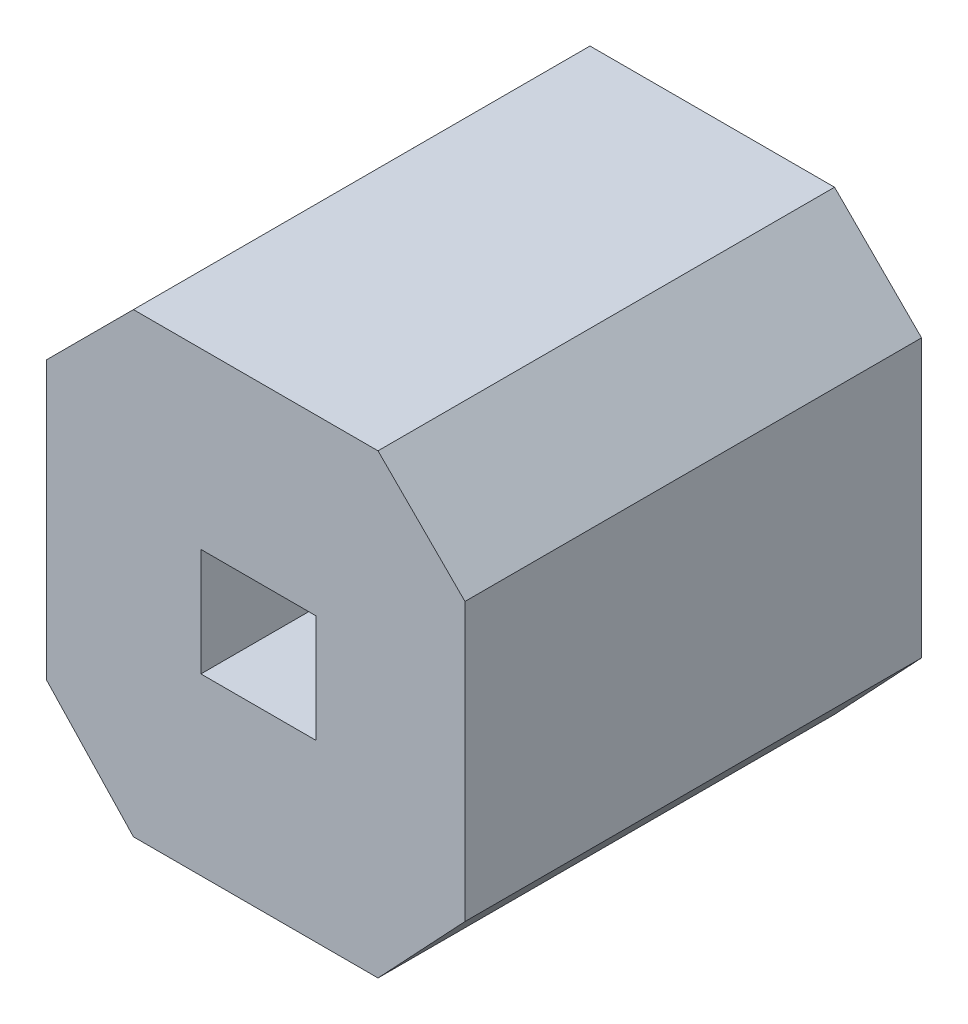
ISO-10303-21;
HEADER;
FILE_DESCRIPTION(('STEP AP214'),'2;1');
FILE_NAME('part.step','',(''),(''),'','','');
FILE_SCHEMA(('AUTOMOTIVE_DESIGN { 1 0 10303 214 1 1 1 1 }'));
ENDSEC;
DATA;
#1=APPLICATION_CONTEXT('core data for automotive mechanical design processes');
#2=APPLICATION_PROTOCOL_DEFINITION('international standard','automotive_design',2000,#1);
#3=PRODUCT_CONTEXT('',#1,'mechanical');
#4=PRODUCT('Part','Part','',(#3));
#5=PRODUCT_RELATED_PRODUCT_CATEGORY('part','',(#4));
#6=PRODUCT_DEFINITION_FORMATION('','',#4);
#7=PRODUCT_DEFINITION_CONTEXT('part definition',#1,'design');
#8=PRODUCT_DEFINITION('design','',#6,#7);
#9=PRODUCT_DEFINITION_SHAPE('','',#8);
#10=(LENGTH_UNIT() NAMED_UNIT(*) SI_UNIT(.MILLI.,.METRE.));
#11=(NAMED_UNIT(*) PLANE_ANGLE_UNIT() SI_UNIT($,.RADIAN.));
#12=(NAMED_UNIT(*) SI_UNIT($,.STERADIAN.) SOLID_ANGLE_UNIT());
#13=UNCERTAINTY_MEASURE_WITH_UNIT(LENGTH_MEASURE(1.E-05),#10,'distance_accuracy_value','');
#14=(GEOMETRIC_REPRESENTATION_CONTEXT(3) GLOBAL_UNCERTAINTY_ASSIGNED_CONTEXT((#13)) GLOBAL_UNIT_ASSIGNED_CONTEXT((#10,
#11,#12)) REPRESENTATION_CONTEXT('',''));
#15=CARTESIAN_POINT('',(0.,0.,0.));
#16=DIRECTION('',(0.,0.,1.));
#17=DIRECTION('',(1.,0.,0.));
#18=AXIS2_PLACEMENT_3D('',#15,#16,#17);
#19=CARTESIAN_POINT('',(0.08073259147931,0.,-11.));
#20=DIRECTION('',(-1.,0.,0.));
#21=DIRECTION('',(0.,0.,1.));
#22=AXIS2_PLACEMENT_3D('',#19,#20,#21);
#23=PLANE('',#22);
#24=DIRECTION('',(0.,0.,-1.));
#25=VECTOR('',#24,1.);
#26=CARTESIAN_POINT('',(0.08073259147931,0.656542766425,-1.));
#27=LINE('',#26,#25);
#28=CARTESIAN_POINT('',(0.08073259147931,0.656542766425,-1.));
#29=VERTEX_POINT('',#28);
#30=CARTESIAN_POINT('',(0.08073259147931,0.656542766425,-3.54));
#31=VERTEX_POINT('',#30);
#32=EDGE_CURVE('E143',#29,#31,#27,.T.);
#33=ORIENTED_EDGE('',*,*,#32,.F.);
#34=DIRECTION('',(0.,-1.,0.));
#35=VECTOR('',#34,1.);
#36=CARTESIAN_POINT('',(0.08073259147931,0.,-1.));
#37=LINE('',#36,#35);
#38=CARTESIAN_POINT('',(0.08073259147931,2.198685623546,-1.));
#39=VERTEX_POINT('',#38);
#40=EDGE_CURVE('E226',#39,#29,#37,.T.);
#41=ORIENTED_EDGE('',*,*,#40,.F.);
#42=DIRECTION('',(0.,0.,-1.));
#43=VECTOR('',#42,1.);
#44=CARTESIAN_POINT('',(0.08073259147931,2.198685623546,-1.));
#45=LINE('',#44,#43);
#46=CARTESIAN_POINT('',(0.08073259147931,2.198685623546,-3.54));
#47=VERTEX_POINT('',#46);
#48=EDGE_CURVE('E159',#39,#47,#45,.T.);
#49=ORIENTED_EDGE('',*,*,#48,.T.);
#50=DIRECTION('',(0.,-1.,0.));
#51=VECTOR('',#50,1.);
#52=CARTESIAN_POINT('',(0.08073259147931,20.864971337567,-3.54));
#53=LINE('',#52,#51);
#54=EDGE_CURVE('E158',#47,#31,#53,.T.);
#55=ORIENTED_EDGE('',*,*,#54,.T.);
#56=EDGE_LOOP('',(#33,#41,#49,#55));
#57=FACE_BOUND('',#56,.T.);
#58=ADVANCED_FACE('F17',(#57),#23,.T.);
#59=CARTESIAN_POINT('',(2.409054020018,0.,-11.));
#60=DIRECTION('',(-1.,0.,0.));
#61=DIRECTION('',(0.,0.,1.));
#62=AXIS2_PLACEMENT_3D('',#59,#60,#61);
#63=PLANE('',#62);
#64=DIRECTION('',(0.,-1.,0.));
#65=VECTOR('',#64,1.);
#66=CARTESIAN_POINT('',(2.409054020018,20.864971337567,-3.54));
#67=LINE('',#66,#65);
#68=CARTESIAN_POINT('',(2.409054020018,2.198685623546,-3.54));
#69=VERTEX_POINT('',#68);
#70=CARTESIAN_POINT('',(2.409054020018,0.656542766425,-3.54));
#71=VERTEX_POINT('',#70);
#72=EDGE_CURVE('E192',#69,#71,#67,.T.);
#73=ORIENTED_EDGE('',*,*,#72,.F.);
#74=DIRECTION('',(0.,0.,-1.));
#75=VECTOR('',#74,1.);
#76=CARTESIAN_POINT('',(2.409054020018,2.198685623546,-1.));
#77=LINE('',#76,#75);
#78=CARTESIAN_POINT('',(2.409054020018,2.198685623546,-1.));
#79=VERTEX_POINT('',#78);
#80=EDGE_CURVE('E11',#79,#69,#77,.T.);
#81=ORIENTED_EDGE('',*,*,#80,.F.);
#82=DIRECTION('',(0.,-1.,0.));
#83=VECTOR('',#82,1.);
#84=CARTESIAN_POINT('',(2.409054020018,0.,-1.));
#85=LINE('',#84,#83);
#86=CARTESIAN_POINT('',(2.409054020018,0.656542766425,-1.));
#87=VERTEX_POINT('',#86);
#88=EDGE_CURVE('E181',#79,#87,#85,.T.);
#89=ORIENTED_EDGE('',*,*,#88,.T.);
#90=DIRECTION('',(0.,0.,-1.));
#91=VECTOR('',#90,1.);
#92=CARTESIAN_POINT('',(2.409054020018,0.656542766425,-1.));
#93=LINE('',#92,#91);
#94=EDGE_CURVE('E214',#87,#71,#93,.T.);
#95=ORIENTED_EDGE('',*,*,#94,.T.);
#96=EDGE_LOOP('',(#73,#81,#89,#95));
#97=FACE_BOUND('',#96,.T.);
#98=ADVANCED_FACE('F306',(#97),#63,.F.);
#99=CARTESIAN_POINT('',(1.925232591453,2.68250705211,-1.));
#100=DIRECTION('',(-0.707106781186548,-0.707106781186548,0.));
#101=DIRECTION('',(-0.707106781186548,0.707106781186548,0.));
#102=AXIS2_PLACEMENT_3D('',#99,#100,#101);
#103=PLANE('',#102);
#104=ORIENTED_EDGE('',*,*,#80,.T.);
#105=DIRECTION('',(0.707106781186548,-0.707106781186548,0.));
#106=VECTOR('',#105,1.);
#107=CARTESIAN_POINT('',(1.925232591453,2.68250705211,-3.54));
#108=LINE('',#107,#106);
#109=CARTESIAN_POINT('',(1.925232591453,2.68250705211,-3.54));
#110=VERTEX_POINT('',#109);
#111=EDGE_CURVE('E196',#110,#69,#108,.T.);
#112=ORIENTED_EDGE('',*,*,#111,.F.);
#113=DIRECTION('',(0.,0.,-1.));
#114=VECTOR('',#113,1.);
#115=CARTESIAN_POINT('',(1.925232591453,2.68250705211,-1.));
#116=LINE('',#115,#114);
#117=CARTESIAN_POINT('',(1.925232591453,2.68250705211,-1.));
#118=VERTEX_POINT('',#117);
#119=EDGE_CURVE('E28',#118,#110,#116,.T.);
#120=ORIENTED_EDGE('',*,*,#119,.F.);
#121=DIRECTION('',(0.707106781186548,-0.707106781186548,0.));
#122=VECTOR('',#121,1.);
#123=CARTESIAN_POINT('',(1.925232591453,2.68250705211,-1.));
#124=LINE('',#123,#122);
#125=EDGE_CURVE('E205',#118,#79,#124,.T.);
#126=ORIENTED_EDGE('',*,*,#125,.T.);
#127=EDGE_LOOP('',(#104,#112,#120,#126));
#128=FACE_BOUND('',#127,.T.);
#129=ADVANCED_FACE('F312',(#128),#103,.F.);
#130=CARTESIAN_POINT('',(0.564518305758,2.68250705211,-1.));
#131=DIRECTION('',(0.,-1.,0.));
#132=DIRECTION('',(0.,0.,-1.));
#133=AXIS2_PLACEMENT_3D('',#130,#131,#132);
#134=PLANE('',#133);
#135=ORIENTED_EDGE('',*,*,#119,.T.);
#136=DIRECTION('',(-1.,0.,0.));
#137=VECTOR('',#136,1.);
#138=CARTESIAN_POINT('',(1.925232591453,2.68250705211,-3.54));
#139=LINE('',#138,#137);
#140=CARTESIAN_POINT('',(0.564518305758,2.68250705211,-3.54));
#141=VERTEX_POINT('',#140);
#142=EDGE_CURVE('E191',#110,#141,#139,.T.);
#143=ORIENTED_EDGE('',*,*,#142,.T.);
#144=DIRECTION('',(0.,0.,-1.));
#145=VECTOR('',#144,1.);
#146=CARTESIAN_POINT('',(0.564518305758,2.68250705211,-1.));
#147=LINE('',#146,#145);
#148=CARTESIAN_POINT('',(0.564518305758,2.68250705211,-1.));
#149=VERTEX_POINT('',#148);
#150=EDGE_CURVE('E42',#149,#141,#147,.T.);
#151=ORIENTED_EDGE('',*,*,#150,.F.);
#152=DIRECTION('',(-1.,0.,0.));
#153=VECTOR('',#152,1.);
#154=CARTESIAN_POINT('',(1.925232591453,2.68250705211,-1.));
#155=LINE('',#154,#153);
#156=EDGE_CURVE('E200',#118,#149,#155,.T.);
#157=ORIENTED_EDGE('',*,*,#156,.F.);
#158=EDGE_LOOP('',(#135,#143,#151,#157));
#159=FACE_BOUND('',#158,.T.);
#160=ADVANCED_FACE('F317',(#159),#134,.F.);
#161=CARTESIAN_POINT('',(0.08073259147931,2.198685623546,-1.));
#162=DIRECTION('',(0.707132879947887,-0.707080681461887,0.));
#163=DIRECTION('',(0.,0.,-1.));
#164=AXIS2_PLACEMENT_3D('',#161,#162,#163);
#165=PLANE('',#164);
#166=ORIENTED_EDGE('',*,*,#150,.T.);
#167=DIRECTION('',(-0.707080681461887,-0.707132879947887,0.));
#168=VECTOR('',#167,1.);
#169=CARTESIAN_POINT('',(0.564518305758,2.68250705211,-3.54));
#170=LINE('',#169,#168);
#171=EDGE_CURVE('E163',#141,#47,#170,.T.);
#172=ORIENTED_EDGE('',*,*,#171,.T.);
#173=ORIENTED_EDGE('',*,*,#48,.F.);
#174=DIRECTION('',(-0.707080681461887,-0.707132879947887,0.));
#175=VECTOR('',#174,1.);
#176=CARTESIAN_POINT('',(0.564518305758,2.68250705211,-1.));
#177=LINE('',#176,#175);
#178=EDGE_CURVE('E204',#149,#39,#177,.T.);
#179=ORIENTED_EDGE('',*,*,#178,.F.);
#180=EDGE_LOOP('',(#166,#172,#173,#179));
#181=FACE_BOUND('',#180,.T.);
#182=ADVANCED_FACE('F323',(#181),#165,.F.);
#183=CARTESIAN_POINT('',(0.564518305758,0.142507052146,-1.));
#184=DIRECTION('',(0.728208904717931,0.685355229854935,0.));
#185=DIRECTION('',(0.,0.,-1.));
#186=AXIS2_PLACEMENT_3D('',#183,#184,#185);
#187=PLANE('',#186);
#188=ORIENTED_EDGE('',*,*,#32,.T.);
#189=DIRECTION('',(-0.685355229854935,0.728208904717931,0.));
#190=VECTOR('',#189,1.);
#191=CARTESIAN_POINT('',(0.564518305758,0.142507052146,-3.54));
#192=LINE('',#191,#190);
#193=CARTESIAN_POINT('',(0.564518305758,0.142507052146,-3.54));
#194=VERTEX_POINT('',#193);
#195=EDGE_CURVE('E147',#194,#31,#192,.T.);
#196=ORIENTED_EDGE('',*,*,#195,.F.);
#197=DIRECTION('',(0.,0.,-1.));
#198=VECTOR('',#197,1.);
#199=CARTESIAN_POINT('',(0.564518305758,0.142507052146,-1.));
#200=LINE('',#199,#198);
#201=CARTESIAN_POINT('',(0.564518305758,0.142507052146,-1.));
#202=VERTEX_POINT('',#201);
#203=EDGE_CURVE('E155',#202,#194,#200,.T.);
#204=ORIENTED_EDGE('',*,*,#203,.F.);
#205=DIRECTION('',(-0.685355229854935,0.728208904717931,0.));
#206=VECTOR('',#205,1.);
#207=CARTESIAN_POINT('',(0.564518305758,0.142507052146,-1.));
#208=LINE('',#207,#206);
#209=EDGE_CURVE('E150',#202,#29,#208,.T.);
#210=ORIENTED_EDGE('',*,*,#209,.T.);
#211=EDGE_LOOP('',(#188,#196,#204,#210));
#212=FACE_BOUND('',#211,.T.);
#213=ADVANCED_FACE('F145',(#212),#187,.F.);
#214=CARTESIAN_POINT('',(1.925232591453,0.142507052146,-1.));
#215=DIRECTION('',(0.,1.,0.));
#216=DIRECTION('',(1.,0.,0.));
#217=AXIS2_PLACEMENT_3D('',#214,#215,#216);
#218=PLANE('',#217);
#219=ORIENTED_EDGE('',*,*,#203,.T.);
#220=DIRECTION('',(-1.,0.,0.));
#221=VECTOR('',#220,1.);
#222=CARTESIAN_POINT('',(1.925232591453,0.142507052146,-3.54));
#223=LINE('',#222,#221);
#224=CARTESIAN_POINT('',(1.925232591453,0.142507052146,-3.54));
#225=VERTEX_POINT('',#224);
#226=EDGE_CURVE('E170',#225,#194,#223,.T.);
#227=ORIENTED_EDGE('',*,*,#226,.F.);
#228=DIRECTION('',(0.,0.,-1.));
#229=VECTOR('',#228,1.);
#230=CARTESIAN_POINT('',(1.925232591453,0.142507052146,-1.));
#231=LINE('',#230,#229);
#232=CARTESIAN_POINT('',(1.925232591453,0.142507052146,-1.));
#233=VERTEX_POINT('',#232);
#234=EDGE_CURVE('E227',#233,#225,#231,.T.);
#235=ORIENTED_EDGE('',*,*,#234,.F.);
#236=DIRECTION('',(-1.,0.,0.));
#237=VECTOR('',#236,1.);
#238=CARTESIAN_POINT('',(1.925232591453,0.142507052146,-1.));
#239=LINE('',#238,#237);
#240=EDGE_CURVE('E222',#233,#202,#239,.T.);
#241=ORIENTED_EDGE('',*,*,#240,.T.);
#242=EDGE_LOOP('',(#219,#227,#235,#241));
#243=FACE_BOUND('',#242,.T.);
#244=ADVANCED_FACE('F334',(#243),#218,.F.);
#245=CARTESIAN_POINT('',(2.409054020018,0.656542766425,-1.));
#246=DIRECTION('',(-0.728183654227159,0.68538205821015,0.));
#247=DIRECTION('',(0.,0.,1.));
#248=AXIS2_PLACEMENT_3D('',#245,#246,#247);
#249=PLANE('',#248);
#250=ORIENTED_EDGE('',*,*,#234,.T.);
#251=DIRECTION('',(0.68538205821015,0.728183654227159,0.));
#252=VECTOR('',#251,1.);
#253=CARTESIAN_POINT('',(1.925232591453,0.142507052146,-3.54));
#254=LINE('',#253,#252);
#255=EDGE_CURVE('E177',#225,#71,#254,.T.);
#256=ORIENTED_EDGE('',*,*,#255,.T.);
#257=ORIENTED_EDGE('',*,*,#94,.F.);
#258=DIRECTION('',(0.68538205821015,0.728183654227159,0.));
#259=VECTOR('',#258,1.);
#260=CARTESIAN_POINT('',(1.925232591453,0.142507052146,-1.));
#261=LINE('',#260,#259);
#262=EDGE_CURVE('E218',#233,#87,#261,.T.);
#263=ORIENTED_EDGE('',*,*,#262,.F.);
#264=EDGE_LOOP('',(#250,#256,#257,#263));
#265=FACE_BOUND('',#264,.T.);
#266=ADVANCED_FACE('F19',(#265),#249,.F.);
#267=CARTESIAN_POINT('',(0.940000448466,1.114899909275,-1.));
#268=DIRECTION('',(1.,0.,0.));
#269=DIRECTION('',(0.,1.,0.));
#270=AXIS2_PLACEMENT_3D('',#267,#268,#269);
#271=PLANE('',#270);
#272=DIRECTION('',(0.,-1.,0.));
#273=VECTOR('',#272,1.);
#274=CARTESIAN_POINT('',(0.940000448466,20.864971337567,-1.));
#275=LINE('',#274,#273);
#276=CARTESIAN_POINT('',(0.940000448466,1.714899909267,-1.));
#277=VERTEX_POINT('',#276);
#278=CARTESIAN_POINT('',(0.940000448466,1.114899909275,-1.));
#279=VERTEX_POINT('',#278);
#280=EDGE_CURVE('E187',#277,#279,#275,.T.);
#281=ORIENTED_EDGE('',*,*,#280,.T.);
#282=DIRECTION('',(0.,0.,1.));
#283=VECTOR('',#282,1.);
#284=CARTESIAN_POINT('',(0.940000448466,1.114899909275,-1.));
#285=LINE('',#284,#283);
#286=CARTESIAN_POINT('',(0.940000448466,1.114899909275,-3.54));
#287=VERTEX_POINT('',#286);
#288=EDGE_CURVE('E21',#287,#279,#285,.T.);
#289=ORIENTED_EDGE('',*,*,#288,.F.);
#290=DIRECTION('',(0.,1.,0.));
#291=VECTOR('',#290,1.);
#292=CARTESIAN_POINT('',(0.940000448466,20.864971337567,-3.54));
#293=LINE('',#292,#291);
#294=CARTESIAN_POINT('',(0.940000448466,1.714899909267,-3.54));
#295=VERTEX_POINT('',#294);
#296=EDGE_CURVE('E250',#287,#295,#293,.T.);
#297=ORIENTED_EDGE('',*,*,#296,.T.);
#298=DIRECTION('',(0.,0.,-1.));
#299=VECTOR('',#298,1.);
#300=CARTESIAN_POINT('',(0.940000448466,1.714899909267,-1.));
#301=LINE('',#300,#299);
#302=EDGE_CURVE('E75',#277,#295,#301,.T.);
#303=ORIENTED_EDGE('',*,*,#302,.F.);
#304=EDGE_LOOP('',(#281,#289,#297,#303));
#305=FACE_BOUND('',#304,.T.);
#306=ADVANCED_FACE('F294',(#305),#271,.T.);
#307=CARTESIAN_POINT('',(0.940000448466,1.714899909267,-1.));
#308=DIRECTION('',(0.,-1.,0.));
#309=DIRECTION('',(0.,0.,-1.));
#310=AXIS2_PLACEMENT_3D('',#307,#308,#309);
#311=PLANE('',#310);
#312=DIRECTION('',(-1.,0.,0.));
#313=VECTOR('',#312,1.);
#314=CARTESIAN_POINT('',(-13.9305531226,1.714899909267,-1.));
#315=LINE('',#314,#313);
#316=CARTESIAN_POINT('',(1.580000162743,1.714899909267,-1.));
#317=VERTEX_POINT('',#316);
#318=EDGE_CURVE('E208',#317,#277,#315,.T.);
#319=ORIENTED_EDGE('',*,*,#318,.T.);
#320=ORIENTED_EDGE('',*,*,#302,.T.);
#321=DIRECTION('',(1.,0.,0.));
#322=VECTOR('',#321,1.);
#323=CARTESIAN_POINT('',(-13.9305531226,1.714899909267,-3.54));
#324=LINE('',#323,#322);
#325=CARTESIAN_POINT('',(1.580000162743,1.714899909267,-3.54));
#326=VERTEX_POINT('',#325);
#327=EDGE_CURVE('E256',#295,#326,#324,.T.);
#328=ORIENTED_EDGE('',*,*,#327,.T.);
#329=DIRECTION('',(0.,0.,-1.));
#330=VECTOR('',#329,1.);
#331=CARTESIAN_POINT('',(1.580000162743,1.714899909267,-1.));
#332=LINE('',#331,#330);
#333=EDGE_CURVE('E86',#317,#326,#332,.T.);
#334=ORIENTED_EDGE('',*,*,#333,.F.);
#335=EDGE_LOOP('',(#319,#320,#328,#334));
#336=FACE_BOUND('',#335,.T.);
#337=ADVANCED_FACE('F292',(#336),#311,.T.);
#338=CARTESIAN_POINT('',(1.580000162743,1.714899909267,-1.));
#339=DIRECTION('',(-1.,0.,0.));
#340=DIRECTION('',(0.,0.,1.));
#341=AXIS2_PLACEMENT_3D('',#338,#339,#340);
#342=PLANE('',#341);
#343=DIRECTION('',(0.,1.,0.));
#344=VECTOR('',#343,1.);
#345=CARTESIAN_POINT('',(1.580000162743,20.864971337567,-1.));
#346=LINE('',#345,#344);
#347=CARTESIAN_POINT('',(1.580000162743,1.114899909275,-1.));
#348=VERTEX_POINT('',#347);
#349=EDGE_CURVE('E188',#348,#317,#346,.T.);
#350=ORIENTED_EDGE('',*,*,#349,.T.);
#351=ORIENTED_EDGE('',*,*,#333,.T.);
#352=DIRECTION('',(0.,-1.,0.));
#353=VECTOR('',#352,1.);
#354=CARTESIAN_POINT('',(1.580000162743,20.864971337567,-3.54));
#355=LINE('',#354,#353);
#356=CARTESIAN_POINT('',(1.580000162743,1.114899909275,-3.54));
#357=VERTEX_POINT('',#356);
#358=EDGE_CURVE('E264',#326,#357,#355,.T.);
#359=ORIENTED_EDGE('',*,*,#358,.T.);
#360=DIRECTION('',(0.,0.,-1.));
#361=VECTOR('',#360,1.);
#362=CARTESIAN_POINT('',(1.580000162743,1.114899909275,-1.));
#363=LINE('',#362,#361);
#364=EDGE_CURVE('E197',#348,#357,#363,.T.);
#365=ORIENTED_EDGE('',*,*,#364,.F.);
#366=EDGE_LOOP('',(#350,#351,#359,#365));
#367=FACE_BOUND('',#366,.T.);
#368=ADVANCED_FACE('F282',(#367),#342,.T.);
#369=CARTESIAN_POINT('',(1.580000162743,1.114899909275,-1.));
#370=DIRECTION('',(0.,1.,0.));
#371=DIRECTION('',(1.,0.,0.));
#372=AXIS2_PLACEMENT_3D('',#369,#370,#371);
#373=PLANE('',#372);
#374=DIRECTION('',(1.,0.,0.));
#375=VECTOR('',#374,1.);
#376=CARTESIAN_POINT('',(-13.9305531226,1.114899909275,-1.));
#377=LINE('',#376,#375);
#378=EDGE_CURVE('E183',#279,#348,#377,.T.);
#379=ORIENTED_EDGE('',*,*,#378,.T.);
#380=ORIENTED_EDGE('',*,*,#364,.T.);
#381=DIRECTION('',(-1.,0.,0.));
#382=VECTOR('',#381,1.);
#383=CARTESIAN_POINT('',(-13.9305531226,1.114899909275,-3.54));
#384=LINE('',#383,#382);
#385=EDGE_CURVE('E212',#357,#287,#384,.T.);
#386=ORIENTED_EDGE('',*,*,#385,.T.);
#387=ORIENTED_EDGE('',*,*,#288,.T.);
#388=EDGE_LOOP('',(#379,#380,#386,#387));
#389=FACE_BOUND('',#388,.T.);
#390=ADVANCED_FACE('F284',(#389),#373,.T.);
#391=CARTESIAN_POINT('',(-13.9305531226,20.864971337567,-3.54));
#392=DIRECTION('',(0.,0.,1.));
#393=DIRECTION('',(1.,0.,0.));
#394=AXIS2_PLACEMENT_3D('',#391,#392,#393);
#395=PLANE('',#394);
#396=ORIENTED_EDGE('',*,*,#111,.T.);
#397=ORIENTED_EDGE('',*,*,#72,.T.);
#398=ORIENTED_EDGE('',*,*,#255,.F.);
#399=ORIENTED_EDGE('',*,*,#226,.T.);
#400=ORIENTED_EDGE('',*,*,#195,.T.);
#401=ORIENTED_EDGE('',*,*,#54,.F.);
#402=ORIENTED_EDGE('',*,*,#171,.F.);
#403=ORIENTED_EDGE('',*,*,#142,.F.);
#404=EDGE_LOOP('',(#396,#397,#398,#399,#400,#401,#402,#403));
#405=FACE_BOUND('',#404,.T.);
#406=ORIENTED_EDGE('',*,*,#385,.F.);
#407=ORIENTED_EDGE('',*,*,#358,.F.);
#408=ORIENTED_EDGE('',*,*,#327,.F.);
#409=ORIENTED_EDGE('',*,*,#296,.F.);
#410=EDGE_LOOP('',(#406,#407,#408,#409));
#411=FACE_BOUND('',#410,.T.);
#412=ADVANCED_FACE('F166',(#405,#411),#395,.F.);
#413=CARTESIAN_POINT('',(-13.9305531226,20.864971337567,-1.));
#414=DIRECTION('',(0.,0.,1.));
#415=DIRECTION('',(1.,0.,0.));
#416=AXIS2_PLACEMENT_3D('',#413,#414,#415);
#417=PLANE('',#416);
#418=ORIENTED_EDGE('',*,*,#318,.F.);
#419=ORIENTED_EDGE('',*,*,#349,.F.);
#420=ORIENTED_EDGE('',*,*,#378,.F.);
#421=ORIENTED_EDGE('',*,*,#280,.F.);
#422=EDGE_LOOP('',(#418,#419,#420,#421));
#423=FACE_BOUND('',#422,.T.);
#424=ORIENTED_EDGE('',*,*,#88,.F.);
#425=ORIENTED_EDGE('',*,*,#125,.F.);
#426=ORIENTED_EDGE('',*,*,#156,.T.);
#427=ORIENTED_EDGE('',*,*,#178,.T.);
#428=ORIENTED_EDGE('',*,*,#40,.T.);
#429=ORIENTED_EDGE('',*,*,#209,.F.);
#430=ORIENTED_EDGE('',*,*,#240,.F.);
#431=ORIENTED_EDGE('',*,*,#262,.T.);
#432=EDGE_LOOP('',(#424,#425,#426,#427,#428,#429,#430,#431));
#433=FACE_BOUND('',#432,.T.);
#434=ADVANCED_FACE('F290',(#423,#433),#417,.T.);
#435=CLOSED_SHELL('',(#58,#98,#129,#160,#182,#213,#244,#266,#306,#337,#368,#390,#412,#434));
#436=MANIFOLD_SOLID_BREP('B1',#435);
#437=ADVANCED_BREP_SHAPE_REPRESENTATION('',(#18,#436),#14);
#438=SHAPE_DEFINITION_REPRESENTATION(#9,#437);
ENDSEC;
END-ISO-10303-21;
